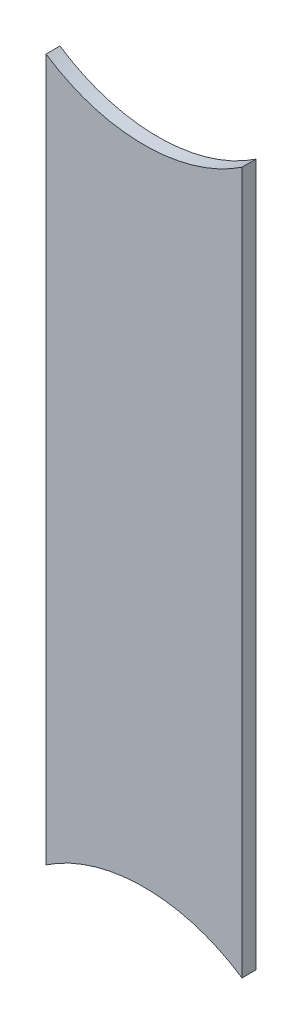
ISO-10303-21;
HEADER;
FILE_DESCRIPTION(('STEP AP214'),'2;1');
FILE_NAME('part.step','',(''),(''),'','','');
FILE_SCHEMA(('AUTOMOTIVE_DESIGN { 1 0 10303 214 1 1 1 1 }'));
ENDSEC;
DATA;
#1=APPLICATION_CONTEXT('core data for automotive mechanical design processes');
#2=APPLICATION_PROTOCOL_DEFINITION('international standard','automotive_design',2000,#1);
#3=PRODUCT_CONTEXT('',#1,'mechanical');
#4=PRODUCT('Part','Part','',(#3));
#5=PRODUCT_RELATED_PRODUCT_CATEGORY('part','',(#4));
#6=PRODUCT_DEFINITION_FORMATION('','',#4);
#7=PRODUCT_DEFINITION_CONTEXT('part definition',#1,'design');
#8=PRODUCT_DEFINITION('design','',#6,#7);
#9=PRODUCT_DEFINITION_SHAPE('','',#8);
#10=(LENGTH_UNIT() NAMED_UNIT(*) SI_UNIT(.MILLI.,.METRE.));
#11=(NAMED_UNIT(*) PLANE_ANGLE_UNIT() SI_UNIT($,.RADIAN.));
#12=(NAMED_UNIT(*) SI_UNIT($,.STERADIAN.) SOLID_ANGLE_UNIT());
#13=UNCERTAINTY_MEASURE_WITH_UNIT(LENGTH_MEASURE(1.E-05),#10,'distance_accuracy_value','');
#14=(GEOMETRIC_REPRESENTATION_CONTEXT(3) GLOBAL_UNCERTAINTY_ASSIGNED_CONTEXT((#13)) GLOBAL_UNIT_ASSIGNED_CONTEXT((#10,
#11,#12)) REPRESENTATION_CONTEXT('',''));
#15=CARTESIAN_POINT('',(0.,0.,0.));
#16=DIRECTION('',(0.,0.,1.));
#17=DIRECTION('',(1.,0.,0.));
#18=AXIS2_PLACEMENT_3D('',#15,#16,#17);
#19=CARTESIAN_POINT('',(33.1499591,43.8741541903459,0.));
#20=DIRECTION('',(-1.,0.,0.));
#21=DIRECTION('',(0.,1.,0.));
#22=AXIS2_PLACEMENT_3D('',#19,#20,#21);
#23=PLANE('',#22);
#24=DIRECTION('',(0.,1.,0.));
#25=VECTOR('',#24,1.);
#26=CARTESIAN_POINT('',(33.1499591,43.4999892,0.03556));
#27=LINE('',#26,#25);
#28=CARTESIAN_POINT('',(33.1499591,43.8741541903459,0.03556));
#29=VERTEX_POINT('',#28);
#30=CARTESIAN_POINT('',(33.1499591,45.6658242096541,0.03556));
#31=VERTEX_POINT('',#30);
#32=EDGE_CURVE('E11',#29,#31,#27,.T.);
#33=ORIENTED_EDGE('',*,*,#32,.F.);
#34=DIRECTION('',(0.,0.,1.));
#35=VECTOR('',#34,1.);
#36=CARTESIAN_POINT('',(33.1499591,43.8741541903459,0.));
#37=LINE('',#36,#35);
#38=CARTESIAN_POINT('',(33.1499591,43.8741541903459,0.));
#39=VERTEX_POINT('',#38);
#40=EDGE_CURVE('E24',#39,#29,#37,.T.);
#41=ORIENTED_EDGE('',*,*,#40,.F.);
#42=DIRECTION('',(0.,1.,0.));
#43=VECTOR('',#42,1.);
#44=CARTESIAN_POINT('',(33.1499591,43.4999892,0.));
#45=LINE('',#44,#43);
#46=CARTESIAN_POINT('',(33.1499591,45.6658242096541,0.));
#47=VERTEX_POINT('',#46);
#48=EDGE_CURVE('E75',#39,#47,#45,.T.);
#49=ORIENTED_EDGE('',*,*,#48,.T.);
#50=DIRECTION('',(0.,0.,1.));
#51=VECTOR('',#50,1.);
#52=CARTESIAN_POINT('',(33.1499591,45.6658242096541,0.));
#53=LINE('',#52,#51);
#54=EDGE_CURVE('E37',#47,#31,#53,.T.);
#55=ORIENTED_EDGE('',*,*,#54,.T.);
#56=EDGE_LOOP('',(#33,#41,#49,#55));
#57=FACE_BOUND('',#56,.T.);
#58=ADVANCED_FACE('F17',(#57),#23,.F.);
#59=CARTESIAN_POINT('',(32.8999596,46.0399892,0.));
#60=DIRECTION('',(0.,0.,-1.));
#61=DIRECTION('',(1.,0.,0.));
#62=AXIS2_PLACEMENT_3D('',#59,#60,#61);
#63=CYLINDRICAL_SURFACE('',#62,0.4499991);
#64=DIRECTION('',(0.,0.,1.));
#65=VECTOR('',#64,1.);
#66=CARTESIAN_POINT('',(32.6499601,45.6658242096541,0.));
#67=LINE('',#66,#65);
#68=CARTESIAN_POINT('',(32.6499601,45.6658242096541,0.));
#69=VERTEX_POINT('',#68);
#70=CARTESIAN_POINT('',(32.6499601,45.6658242096541,0.03556));
#71=VERTEX_POINT('',#70);
#72=EDGE_CURVE('E67',#69,#71,#67,.T.);
#73=ORIENTED_EDGE('',*,*,#72,.T.);
#74=CARTESIAN_POINT('',(32.8999596,46.0399892,0.03556));
#75=DIRECTION('',(0.,0.,1.));
#76=DIRECTION('',(1.,0.,0.));
#77=AXIS2_PLACEMENT_3D('',#74,#75,#76);
#78=CIRCLE('',#77,0.4499991);
#79=EDGE_CURVE('E82',#71,#31,#78,.T.);
#80=ORIENTED_EDGE('',*,*,#79,.T.);
#81=ORIENTED_EDGE('',*,*,#54,.F.);
#82=CARTESIAN_POINT('',(32.8999596,46.0399892,0.));
#83=DIRECTION('',(0.,0.,1.));
#84=DIRECTION('',(1.,0.,0.));
#85=AXIS2_PLACEMENT_3D('',#82,#83,#84);
#86=CIRCLE('',#85,0.4499991);
#87=EDGE_CURVE('E80',#69,#47,#86,.T.);
#88=ORIENTED_EDGE('',*,*,#87,.F.);
#89=EDGE_LOOP('',(#73,#80,#81,#88));
#90=FACE_BOUND('',#89,.T.);
#91=ADVANCED_FACE('F88',(#90),#63,.F.);
#92=CARTESIAN_POINT('',(32.6499601,45.6658242096541,0.));
#93=DIRECTION('',(1.,0.,0.));
#94=DIRECTION('',(0.,-1.,0.));
#95=AXIS2_PLACEMENT_3D('',#92,#93,#94);
#96=PLANE('',#95);
#97=DIRECTION('',(0.,-1.,0.));
#98=VECTOR('',#97,1.);
#99=CARTESIAN_POINT('',(32.6499601,46.0399892,0.03556));
#100=LINE('',#99,#98);
#101=CARTESIAN_POINT('',(32.6499601,43.8741541903459,0.03556));
#102=VERTEX_POINT('',#101);
#103=EDGE_CURVE('E71',#71,#102,#100,.T.);
#104=ORIENTED_EDGE('',*,*,#103,.F.);
#105=ORIENTED_EDGE('',*,*,#72,.F.);
#106=DIRECTION('',(0.,-1.,0.));
#107=VECTOR('',#106,1.);
#108=CARTESIAN_POINT('',(32.6499601,46.0399892,0.));
#109=LINE('',#108,#107);
#110=CARTESIAN_POINT('',(32.6499601,43.8741541903459,0.));
#111=VERTEX_POINT('',#110);
#112=EDGE_CURVE('E63',#69,#111,#109,.T.);
#113=ORIENTED_EDGE('',*,*,#112,.T.);
#114=DIRECTION('',(0.,0.,1.));
#115=VECTOR('',#114,1.);
#116=CARTESIAN_POINT('',(32.6499601,43.8741541903459,0.));
#117=LINE('',#116,#115);
#118=EDGE_CURVE('E53',#111,#102,#117,.T.);
#119=ORIENTED_EDGE('',*,*,#118,.T.);
#120=EDGE_LOOP('',(#104,#105,#113,#119));
#121=FACE_BOUND('',#120,.T.);
#122=ADVANCED_FACE('F66',(#121),#96,.F.);
#123=CARTESIAN_POINT('',(32.8999596,43.4999892,0.));
#124=DIRECTION('',(0.,0.,-1.));
#125=DIRECTION('',(1.,0.,0.));
#126=AXIS2_PLACEMENT_3D('',#123,#124,#125);
#127=CYLINDRICAL_SURFACE('',#126,0.4499991);
#128=ORIENTED_EDGE('',*,*,#40,.T.);
#129=CARTESIAN_POINT('',(32.8999596,43.4999892,0.03556));
#130=DIRECTION('',(0.,0.,1.));
#131=DIRECTION('',(1.,0.,0.));
#132=AXIS2_PLACEMENT_3D('',#129,#130,#131);
#133=CIRCLE('',#132,0.4499991);
#134=EDGE_CURVE('E59',#29,#102,#133,.T.);
#135=ORIENTED_EDGE('',*,*,#134,.T.);
#136=ORIENTED_EDGE('',*,*,#118,.F.);
#137=CARTESIAN_POINT('',(32.8999596,43.4999892,0.));
#138=DIRECTION('',(0.,0.,1.));
#139=DIRECTION('',(1.,0.,0.));
#140=AXIS2_PLACEMENT_3D('',#137,#138,#139);
#141=CIRCLE('',#140,0.4499991);
#142=EDGE_CURVE('E57',#39,#111,#141,.T.);
#143=ORIENTED_EDGE('',*,*,#142,.F.);
#144=EDGE_LOOP('',(#128,#135,#136,#143));
#145=FACE_BOUND('',#144,.T.);
#146=ADVANCED_FACE('F55',(#145),#127,.F.);
#147=CARTESIAN_POINT('',(33.1499591,43.4999892,0.));
#148=DIRECTION('',(0.,0.,-1.));
#149=DIRECTION('',(-1.,0.,0.));
#150=AXIS2_PLACEMENT_3D('',#147,#148,#149);
#151=PLANE('',#150);
#152=ORIENTED_EDGE('',*,*,#48,.F.);
#153=ORIENTED_EDGE('',*,*,#142,.T.);
#154=ORIENTED_EDGE('',*,*,#112,.F.);
#155=ORIENTED_EDGE('',*,*,#87,.T.);
#156=EDGE_LOOP('',(#152,#153,#154,#155));
#157=FACE_BOUND('',#156,.T.);
#158=ADVANCED_FACE('F74',(#157),#151,.T.);
#159=CARTESIAN_POINT('',(33.1499591,43.4999892,0.03556));
#160=DIRECTION('',(0.,0.,-1.));
#161=DIRECTION('',(-1.,0.,0.));
#162=AXIS2_PLACEMENT_3D('',#159,#160,#161);
#163=PLANE('',#162);
#164=ORIENTED_EDGE('',*,*,#134,.F.);
#165=ORIENTED_EDGE('',*,*,#32,.T.);
#166=ORIENTED_EDGE('',*,*,#79,.F.);
#167=ORIENTED_EDGE('',*,*,#103,.T.);
#168=EDGE_LOOP('',(#164,#165,#166,#167));
#169=FACE_BOUND('',#168,.T.);
#170=ADVANCED_FACE('F91',(#169),#163,.F.);
#171=CLOSED_SHELL('',(#58,#91,#122,#146,#158,#170));
#172=MANIFOLD_SOLID_BREP('B1',#171);
#173=ADVANCED_BREP_SHAPE_REPRESENTATION('',(#18,#172),#14);
#174=SHAPE_DEFINITION_REPRESENTATION(#9,#173);
ENDSEC;
END-ISO-10303-21;
